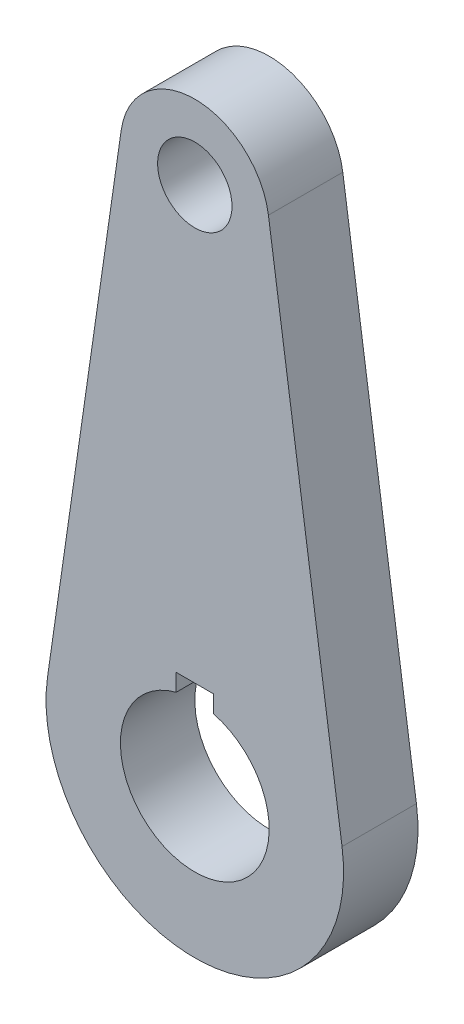
ISO-10303-21;
HEADER;
FILE_DESCRIPTION(('STEP AP214'),'2;1');
FILE_NAME('part.step','',(''),(''),'','','');
FILE_SCHEMA(('AUTOMOTIVE_DESIGN { 1 0 10303 214 1 1 1 1 }'));
ENDSEC;
DATA;
#1=APPLICATION_CONTEXT('core data for automotive mechanical design processes');
#2=APPLICATION_PROTOCOL_DEFINITION('international standard','automotive_design',2000,#1);
#3=PRODUCT_CONTEXT('',#1,'mechanical');
#4=PRODUCT('Part','Part','',(#3));
#5=PRODUCT_RELATED_PRODUCT_CATEGORY('part','',(#4));
#6=PRODUCT_DEFINITION_FORMATION('','',#4);
#7=PRODUCT_DEFINITION_CONTEXT('part definition',#1,'design');
#8=PRODUCT_DEFINITION('design','',#6,#7);
#9=PRODUCT_DEFINITION_SHAPE('','',#8);
#10=(LENGTH_UNIT() NAMED_UNIT(*) SI_UNIT(.MILLI.,.METRE.));
#11=(NAMED_UNIT(*) PLANE_ANGLE_UNIT() SI_UNIT($,.RADIAN.));
#12=(NAMED_UNIT(*) SI_UNIT($,.STERADIAN.) SOLID_ANGLE_UNIT());
#13=UNCERTAINTY_MEASURE_WITH_UNIT(LENGTH_MEASURE(1.E-05),#10,'distance_accuracy_value','');
#14=(GEOMETRIC_REPRESENTATION_CONTEXT(3) GLOBAL_UNCERTAINTY_ASSIGNED_CONTEXT((#13)) GLOBAL_UNIT_ASSIGNED_CONTEXT((#10,
#11,#12)) REPRESENTATION_CONTEXT('',''));
#15=CARTESIAN_POINT('',(0.,0.,0.));
#16=DIRECTION('',(0.,0.,1.));
#17=DIRECTION('',(1.,0.,0.));
#18=AXIS2_PLACEMENT_3D('',#15,#16,#17);
#19=CARTESIAN_POINT('',(0.,70.,10.));
#20=DIRECTION('',(0.,0.,-1.));
#21=DIRECTION('',(-1.,0.,0.));
#22=AXIS2_PLACEMENT_3D('',#19,#20,#21);
#23=CYLINDRICAL_SURFACE('',#22,10.);
#24=DIRECTION('',(0.,0.,-1.));
#25=VECTOR('',#24,1.);
#26=CARTESIAN_POINT('',(-9.89743318610788,71.4285714285714,10.));
#27=LINE('',#26,#25);
#28=CARTESIAN_POINT('',(-9.89743318610788,71.4285714285714,10.));
#29=VERTEX_POINT('',#28);
#30=CARTESIAN_POINT('',(-9.89743318610788,71.4285714285714,0.));
#31=VERTEX_POINT('',#30);
#32=EDGE_CURVE('E120',#29,#31,#27,.T.);
#33=ORIENTED_EDGE('',*,*,#32,.F.);
#34=CARTESIAN_POINT('',(0.,70.,10.));
#35=DIRECTION('',(0.,0.,1.));
#36=DIRECTION('',(1.,0.,0.));
#37=AXIS2_PLACEMENT_3D('',#34,#35,#36);
#38=CIRCLE('',#37,10.);
#39=CARTESIAN_POINT('',(9.89743318610787,71.4285714285714,10.));
#40=VERTEX_POINT('',#39);
#41=EDGE_CURVE('E114',#40,#29,#38,.T.);
#42=ORIENTED_EDGE('',*,*,#41,.F.);
#43=DIRECTION('',(0.,0.,-1.));
#44=VECTOR('',#43,1.);
#45=CARTESIAN_POINT('',(9.89743318610787,71.4285714285714,10.));
#46=LINE('',#45,#44);
#47=CARTESIAN_POINT('',(9.89743318610787,71.4285714285714,0.));
#48=VERTEX_POINT('',#47);
#49=EDGE_CURVE('E53',#40,#48,#46,.T.);
#50=ORIENTED_EDGE('',*,*,#49,.T.);
#51=CARTESIAN_POINT('',(0.,70.,0.));
#52=DIRECTION('',(0.,0.,1.));
#53=DIRECTION('',(1.,0.,0.));
#54=AXIS2_PLACEMENT_3D('',#51,#52,#53);
#55=CIRCLE('',#54,10.);
#56=EDGE_CURVE('E150',#48,#31,#55,.T.);
#57=ORIENTED_EDGE('',*,*,#56,.T.);
#58=EDGE_LOOP('',(#33,#42,#50,#57));
#59=FACE_BOUND('',#58,.T.);
#60=ADVANCED_FACE('F44',(#59),#23,.T.);
#61=CARTESIAN_POINT('',(0.,70.,10.));
#62=DIRECTION('',(0.,0.,-1.));
#63=DIRECTION('',(-1.,0.,0.));
#64=AXIS2_PLACEMENT_3D('',#61,#62,#63);
#65=CYLINDRICAL_SURFACE('',#64,5.);
#66=CARTESIAN_POINT('',(0.,70.,0.));
#67=DIRECTION('',(0.,0.,1.));
#68=DIRECTION('',(1.,0.,0.));
#69=AXIS2_PLACEMENT_3D('',#66,#67,#68);
#70=CIRCLE('',#69,5.);
#71=CARTESIAN_POINT('',(5.,70.,0.));
#72=VERTEX_POINT('',#71);
#73=EDGE_CURVE('E122',#72,#72,#70,.T.);
#74=ORIENTED_EDGE('',*,*,#73,.F.);
#75=EDGE_LOOP('',(#74));
#76=FACE_BOUND('',#75,.T.);
#77=CARTESIAN_POINT('',(0.,70.,10.));
#78=DIRECTION('',(0.,0.,1.));
#79=DIRECTION('',(1.,0.,0.));
#80=AXIS2_PLACEMENT_3D('',#77,#78,#79);
#81=CIRCLE('',#80,5.);
#82=CARTESIAN_POINT('',(5.,70.,10.));
#83=VERTEX_POINT('',#82);
#84=EDGE_CURVE('E47',#83,#83,#81,.T.);
#85=ORIENTED_EDGE('',*,*,#84,.T.);
#86=EDGE_LOOP('',(#85));
#87=FACE_BOUND('',#86,.T.);
#88=ADVANCED_FACE('F166',(#76,#87),#65,.F.);
#89=CARTESIAN_POINT('',(0.,0.,10.));
#90=DIRECTION('',(0.,0.,1.));
#91=DIRECTION('',(1.,0.,0.));
#92=AXIS2_PLACEMENT_3D('',#89,#90,#91);
#93=PLANE('',#92);
#94=DIRECTION('',(-0.142857142857143,0.989743318610787,0.));
#95=VECTOR('',#94,1.);
#96=CARTESIAN_POINT('',(9.89743318610787,71.4285714285714,10.));
#97=LINE('',#96,#95);
#98=CARTESIAN_POINT('',(19.7948663722157,2.85714285714286,10.));
#99=VERTEX_POINT('',#98);
#100=EDGE_CURVE('E121',#99,#40,#97,.T.);
#101=ORIENTED_EDGE('',*,*,#100,.T.);
#102=ORIENTED_EDGE('',*,*,#41,.T.);
#103=DIRECTION('',(-0.142857142857143,-0.989743318610787,0.));
#104=VECTOR('',#103,1.);
#105=CARTESIAN_POINT('',(-19.7948663722158,2.85714285714286,10.));
#106=LINE('',#105,#104);
#107=CARTESIAN_POINT('',(-19.7948663722158,2.85714285714286,10.));
#108=VERTEX_POINT('',#107);
#109=EDGE_CURVE('E134',#29,#108,#106,.T.);
#110=ORIENTED_EDGE('',*,*,#109,.T.);
#111=CARTESIAN_POINT('',(0.,0.,10.));
#112=DIRECTION('',(0.,0.,1.));
#113=DIRECTION('',(1.,0.,0.));
#114=AXIS2_PLACEMENT_3D('',#111,#112,#113);
#115=CIRCLE('',#114,20.);
#116=EDGE_CURVE('E135',#108,#99,#115,.T.);
#117=ORIENTED_EDGE('',*,*,#116,.T.);
#118=EDGE_LOOP('',(#101,#102,#110,#117));
#119=FACE_BOUND('',#118,.T.);
#120=DIRECTION('',(0.,1.,0.));
#121=VECTOR('',#120,1.);
#122=CARTESIAN_POINT('',(2.5,12.,10.));
#123=LINE('',#122,#121);
#124=CARTESIAN_POINT('',(2.5,9.68245836551854,10.));
#125=VERTEX_POINT('',#124);
#126=CARTESIAN_POINT('',(2.5,12.,10.));
#127=VERTEX_POINT('',#126);
#128=EDGE_CURVE('E221',#125,#127,#123,.T.);
#129=ORIENTED_EDGE('',*,*,#128,.F.);
#130=CARTESIAN_POINT('',(0.,0.,10.));
#131=DIRECTION('',(0.,0.,1.));
#132=DIRECTION('',(1.,0.,0.));
#133=AXIS2_PLACEMENT_3D('',#130,#131,#132);
#134=CIRCLE('',#133,10.);
#135=CARTESIAN_POINT('',(-2.5,9.68245836551854,10.));
#136=VERTEX_POINT('',#135);
#137=EDGE_CURVE('E200',#136,#125,#134,.T.);
#138=ORIENTED_EDGE('',*,*,#137,.F.);
#139=DIRECTION('',(0.,-1.,0.));
#140=VECTOR('',#139,1.);
#141=CARTESIAN_POINT('',(-2.5,9.68245836551854,10.));
#142=LINE('',#141,#140);
#143=CARTESIAN_POINT('',(-2.5,12.,10.));
#144=VERTEX_POINT('',#143);
#145=EDGE_CURVE('E215',#144,#136,#142,.T.);
#146=ORIENTED_EDGE('',*,*,#145,.F.);
#147=DIRECTION('',(-1.,0.,0.));
#148=VECTOR('',#147,1.);
#149=CARTESIAN_POINT('',(-2.5,12.,10.));
#150=LINE('',#149,#148);
#151=EDGE_CURVE('E225',#127,#144,#150,.T.);
#152=ORIENTED_EDGE('',*,*,#151,.F.);
#153=EDGE_LOOP('',(#129,#138,#146,#152));
#154=FACE_BOUND('',#153,.T.);
#155=ORIENTED_EDGE('',*,*,#84,.F.);
#156=EDGE_LOOP('',(#155));
#157=FACE_BOUND('',#156,.T.);
#158=ADVANCED_FACE('F129',(#119,#154,#157),#93,.T.);
#159=CARTESIAN_POINT('',(0.,0.,0.));
#160=DIRECTION('',(0.,0.,1.));
#161=DIRECTION('',(1.,0.,0.));
#162=AXIS2_PLACEMENT_3D('',#159,#160,#161);
#163=PLANE('',#162);
#164=CARTESIAN_POINT('',(0.,0.,0.));
#165=DIRECTION('',(0.,0.,1.));
#166=DIRECTION('',(1.,0.,0.));
#167=AXIS2_PLACEMENT_3D('',#164,#165,#166);
#168=CIRCLE('',#167,20.);
#169=CARTESIAN_POINT('',(-19.7948663722158,2.85714285714286,0.));
#170=VERTEX_POINT('',#169);
#171=CARTESIAN_POINT('',(19.7948663722157,2.85714285714286,0.));
#172=VERTEX_POINT('',#171);
#173=EDGE_CURVE('E142',#170,#172,#168,.T.);
#174=ORIENTED_EDGE('',*,*,#173,.F.);
#175=DIRECTION('',(-0.142857142857143,-0.989743318610787,0.));
#176=VECTOR('',#175,1.);
#177=CARTESIAN_POINT('',(-19.7948663722158,2.85714285714286,0.));
#178=LINE('',#177,#176);
#179=EDGE_CURVE('E138',#31,#170,#178,.T.);
#180=ORIENTED_EDGE('',*,*,#179,.F.);
#181=ORIENTED_EDGE('',*,*,#56,.F.);
#182=DIRECTION('',(-0.142857142857143,0.989743318610787,0.));
#183=VECTOR('',#182,1.);
#184=CARTESIAN_POINT('',(9.89743318610787,71.4285714285714,0.));
#185=LINE('',#184,#183);
#186=EDGE_CURVE('E130',#172,#48,#185,.T.);
#187=ORIENTED_EDGE('',*,*,#186,.F.);
#188=EDGE_LOOP('',(#174,#180,#181,#187));
#189=FACE_BOUND('',#188,.T.);
#190=CARTESIAN_POINT('',(0.,0.,0.));
#191=DIRECTION('',(0.,0.,1.));
#192=DIRECTION('',(1.,0.,0.));
#193=AXIS2_PLACEMENT_3D('',#190,#191,#192);
#194=CIRCLE('',#193,10.);
#195=CARTESIAN_POINT('',(-2.5,9.68245836551854,0.));
#196=VERTEX_POINT('',#195);
#197=CARTESIAN_POINT('',(2.5,9.68245836551854,0.));
#198=VERTEX_POINT('',#197);
#199=EDGE_CURVE('E69',#196,#198,#194,.T.);
#200=ORIENTED_EDGE('',*,*,#199,.T.);
#201=DIRECTION('',(0.,1.,0.));
#202=VECTOR('',#201,1.);
#203=CARTESIAN_POINT('',(2.5,12.,0.));
#204=LINE('',#203,#202);
#205=CARTESIAN_POINT('',(2.5,12.,0.));
#206=VERTEX_POINT('',#205);
#207=EDGE_CURVE('E202',#198,#206,#204,.T.);
#208=ORIENTED_EDGE('',*,*,#207,.T.);
#209=DIRECTION('',(-1.,0.,0.));
#210=VECTOR('',#209,1.);
#211=CARTESIAN_POINT('',(-2.5,12.,0.));
#212=LINE('',#211,#210);
#213=CARTESIAN_POINT('',(-2.5,12.,0.));
#214=VERTEX_POINT('',#213);
#215=EDGE_CURVE('E199',#206,#214,#212,.T.);
#216=ORIENTED_EDGE('',*,*,#215,.T.);
#217=DIRECTION('',(0.,-1.,0.));
#218=VECTOR('',#217,1.);
#219=CARTESIAN_POINT('',(-2.5,9.68245836551854,0.));
#220=LINE('',#219,#218);
#221=EDGE_CURVE('E198',#214,#196,#220,.T.);
#222=ORIENTED_EDGE('',*,*,#221,.T.);
#223=EDGE_LOOP('',(#200,#208,#216,#222));
#224=FACE_BOUND('',#223,.T.);
#225=ORIENTED_EDGE('',*,*,#73,.T.);
#226=EDGE_LOOP('',(#225));
#227=FACE_BOUND('',#226,.T.);
#228=ADVANCED_FACE('F158',(#189,#224,#227),#163,.F.);
#229=CARTESIAN_POINT('',(0.,0.,10.));
#230=DIRECTION('',(0.,0.,-1.));
#231=DIRECTION('',(-1.,0.,0.));
#232=AXIS2_PLACEMENT_3D('',#229,#230,#231);
#233=CYLINDRICAL_SURFACE('',#232,20.);
#234=ORIENTED_EDGE('',*,*,#173,.T.);
#235=DIRECTION('',(0.,0.,-1.));
#236=VECTOR('',#235,1.);
#237=CARTESIAN_POINT('',(19.7948663722157,2.85714285714286,10.));
#238=LINE('',#237,#236);
#239=EDGE_CURVE('E11',#99,#172,#238,.T.);
#240=ORIENTED_EDGE('',*,*,#239,.F.);
#241=ORIENTED_EDGE('',*,*,#116,.F.);
#242=DIRECTION('',(0.,0.,-1.));
#243=VECTOR('',#242,1.);
#244=CARTESIAN_POINT('',(-19.7948663722158,2.85714285714286,10.));
#245=LINE('',#244,#243);
#246=EDGE_CURVE('E137',#108,#170,#245,.T.);
#247=ORIENTED_EDGE('',*,*,#246,.T.);
#248=EDGE_LOOP('',(#234,#240,#241,#247));
#249=FACE_BOUND('',#248,.T.);
#250=ADVANCED_FACE('F50',(#249),#233,.T.);
#251=CARTESIAN_POINT('',(9.89743318610787,71.4285714285714,10.));
#252=DIRECTION('',(-0.989743318610787,-0.142857142857143,0.));
#253=DIRECTION('',(0.142857142857143,-0.989743318610787,0.));
#254=AXIS2_PLACEMENT_3D('',#251,#252,#253);
#255=PLANE('',#254);
#256=ORIENTED_EDGE('',*,*,#186,.T.);
#257=ORIENTED_EDGE('',*,*,#49,.F.);
#258=ORIENTED_EDGE('',*,*,#100,.F.);
#259=ORIENTED_EDGE('',*,*,#239,.T.);
#260=EDGE_LOOP('',(#256,#257,#258,#259));
#261=FACE_BOUND('',#260,.T.);
#262=ADVANCED_FACE('F124',(#261),#255,.F.);
#263=CARTESIAN_POINT('',(-19.7948663722158,2.85714285714286,10.));
#264=DIRECTION('',(0.989743318610787,-0.142857142857143,0.));
#265=DIRECTION('',(0.142857142857143,0.989743318610787,0.));
#266=AXIS2_PLACEMENT_3D('',#263,#264,#265);
#267=PLANE('',#266);
#268=ORIENTED_EDGE('',*,*,#179,.T.);
#269=ORIENTED_EDGE('',*,*,#246,.F.);
#270=ORIENTED_EDGE('',*,*,#109,.F.);
#271=ORIENTED_EDGE('',*,*,#32,.T.);
#272=EDGE_LOOP('',(#268,#269,#270,#271));
#273=FACE_BOUND('',#272,.T.);
#274=ADVANCED_FACE('F152',(#273),#267,.F.);
#275=CARTESIAN_POINT('',(0.,0.,10.));
#276=DIRECTION('',(0.,0.,-1.));
#277=DIRECTION('',(-1.,0.,0.));
#278=AXIS2_PLACEMENT_3D('',#275,#276,#277);
#279=CYLINDRICAL_SURFACE('',#278,10.);
#280=ORIENTED_EDGE('',*,*,#199,.F.);
#281=DIRECTION('',(0.,0.,-1.));
#282=VECTOR('',#281,1.);
#283=CARTESIAN_POINT('',(-2.5,9.68245836551854,10.));
#284=LINE('',#283,#282);
#285=EDGE_CURVE('E196',#136,#196,#284,.T.);
#286=ORIENTED_EDGE('',*,*,#285,.F.);
#287=ORIENTED_EDGE('',*,*,#137,.T.);
#288=DIRECTION('',(0.,0.,-1.));
#289=VECTOR('',#288,1.);
#290=CARTESIAN_POINT('',(2.5,9.68245836551854,10.));
#291=LINE('',#290,#289);
#292=EDGE_CURVE('E144',#125,#198,#291,.T.);
#293=ORIENTED_EDGE('',*,*,#292,.T.);
#294=EDGE_LOOP('',(#280,#286,#287,#293));
#295=FACE_BOUND('',#294,.T.);
#296=ADVANCED_FACE('F179',(#295),#279,.F.);
#297=CARTESIAN_POINT('',(2.5,12.,10.));
#298=DIRECTION('',(-1.,0.,0.));
#299=DIRECTION('',(0.,0.,1.));
#300=AXIS2_PLACEMENT_3D('',#297,#298,#299);
#301=PLANE('',#300);
#302=ORIENTED_EDGE('',*,*,#207,.F.);
#303=ORIENTED_EDGE('',*,*,#292,.F.);
#304=ORIENTED_EDGE('',*,*,#128,.T.);
#305=DIRECTION('',(0.,0.,-1.));
#306=VECTOR('',#305,1.);
#307=CARTESIAN_POINT('',(2.5,12.,10.));
#308=LINE('',#307,#306);
#309=EDGE_CURVE('E212',#127,#206,#308,.T.);
#310=ORIENTED_EDGE('',*,*,#309,.T.);
#311=EDGE_LOOP('',(#302,#303,#304,#310));
#312=FACE_BOUND('',#311,.T.);
#313=ADVANCED_FACE('F184',(#312),#301,.T.);
#314=CARTESIAN_POINT('',(-2.5,12.,10.));
#315=DIRECTION('',(0.,-1.,0.));
#316=DIRECTION('',(0.,0.,-1.));
#317=AXIS2_PLACEMENT_3D('',#314,#315,#316);
#318=PLANE('',#317);
#319=ORIENTED_EDGE('',*,*,#215,.F.);
#320=ORIENTED_EDGE('',*,*,#309,.F.);
#321=ORIENTED_EDGE('',*,*,#151,.T.);
#322=DIRECTION('',(0.,0.,-1.));
#323=VECTOR('',#322,1.);
#324=CARTESIAN_POINT('',(-2.5,12.,10.));
#325=LINE('',#324,#323);
#326=EDGE_CURVE('E63',#144,#214,#325,.T.);
#327=ORIENTED_EDGE('',*,*,#326,.T.);
#328=EDGE_LOOP('',(#319,#320,#321,#327));
#329=FACE_BOUND('',#328,.T.);
#330=ADVANCED_FACE('F190',(#329),#318,.T.);
#331=CARTESIAN_POINT('',(-2.5,9.68245836551854,10.));
#332=DIRECTION('',(1.,0.,0.));
#333=DIRECTION('',(0.,0.,-1.));
#334=AXIS2_PLACEMENT_3D('',#331,#332,#333);
#335=PLANE('',#334);
#336=ORIENTED_EDGE('',*,*,#221,.F.);
#337=ORIENTED_EDGE('',*,*,#326,.F.);
#338=ORIENTED_EDGE('',*,*,#145,.T.);
#339=ORIENTED_EDGE('',*,*,#285,.T.);
#340=EDGE_LOOP('',(#336,#337,#338,#339));
#341=FACE_BOUND('',#340,.T.);
#342=ADVANCED_FACE('F192',(#341),#335,.T.);
#343=CLOSED_SHELL('',(#60,#88,#158,#228,#250,#262,#274,#296,#313,#330,#342));
#344=MANIFOLD_SOLID_BREP('B2',#343);
#345=ADVANCED_BREP_SHAPE_REPRESENTATION('',(#18,#344),#14);
#346=SHAPE_DEFINITION_REPRESENTATION(#9,#345);
ENDSEC;
END-ISO-10303-21;
